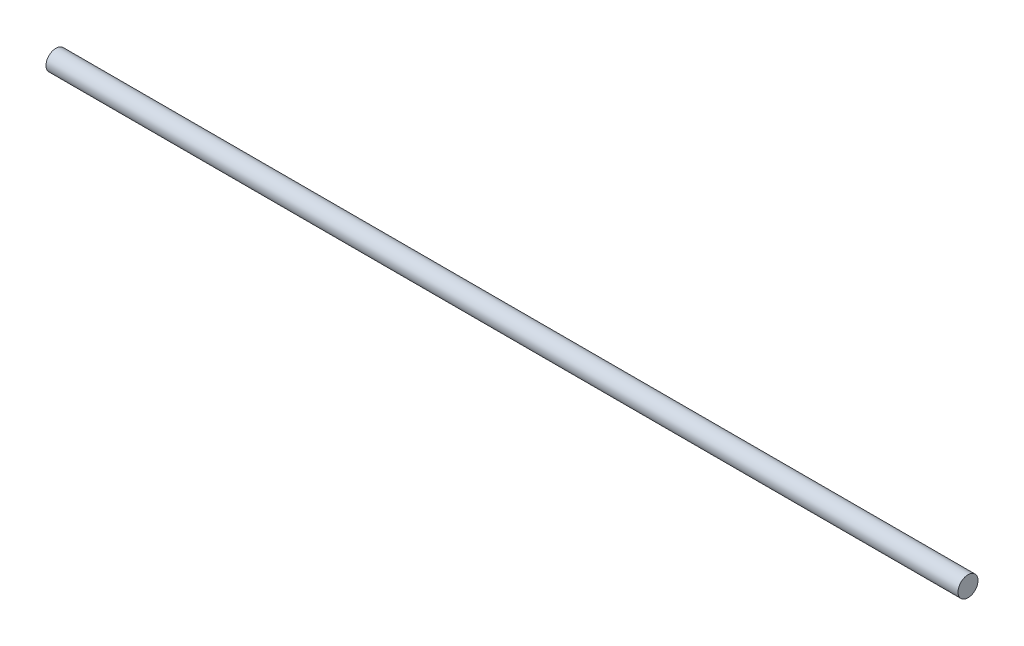
ISO-10303-21;
HEADER;
FILE_DESCRIPTION(('STEP AP214'),'2;1');
FILE_NAME('part.step','',(''),(''),'','','');
FILE_SCHEMA(('AUTOMOTIVE_DESIGN { 1 0 10303 214 1 1 1 1 }'));
ENDSEC;
DATA;
#1=APPLICATION_CONTEXT('core data for automotive mechanical design processes');
#2=APPLICATION_PROTOCOL_DEFINITION('international standard','automotive_design',2000,#1);
#3=PRODUCT_CONTEXT('',#1,'mechanical');
#4=PRODUCT('Part','Part','',(#3));
#5=PRODUCT_RELATED_PRODUCT_CATEGORY('part','',(#4));
#6=PRODUCT_DEFINITION_FORMATION('','',#4);
#7=PRODUCT_DEFINITION_CONTEXT('part definition',#1,'design');
#8=PRODUCT_DEFINITION('design','',#6,#7);
#9=PRODUCT_DEFINITION_SHAPE('','',#8);
#10=(LENGTH_UNIT() NAMED_UNIT(*) SI_UNIT(.MILLI.,.METRE.));
#11=(NAMED_UNIT(*) PLANE_ANGLE_UNIT() SI_UNIT($,.RADIAN.));
#12=(NAMED_UNIT(*) SI_UNIT($,.STERADIAN.) SOLID_ANGLE_UNIT());
#13=UNCERTAINTY_MEASURE_WITH_UNIT(LENGTH_MEASURE(1.E-05),#10,'distance_accuracy_value','');
#14=(GEOMETRIC_REPRESENTATION_CONTEXT(3) GLOBAL_UNCERTAINTY_ASSIGNED_CONTEXT((#13)) GLOBAL_UNIT_ASSIGNED_CONTEXT((#10,
#11,#12)) REPRESENTATION_CONTEXT('',''));
#15=CARTESIAN_POINT('',(0.,0.,0.));
#16=DIRECTION('',(0.,0.,1.));
#17=DIRECTION('',(1.,0.,0.));
#18=AXIS2_PLACEMENT_3D('',#15,#16,#17);
#19=CARTESIAN_POINT('',(228.,0.,0.));
#20=DIRECTION('',(-1.,0.,0.));
#21=DIRECTION('',(0.,0.,1.));
#22=AXIS2_PLACEMENT_3D('',#19,#20,#21);
#23=CYLINDRICAL_SURFACE('',#22,2.5);
#24=CARTESIAN_POINT('',(228.,0.,0.));
#25=DIRECTION('',(1.,0.,0.));
#26=DIRECTION('',(0.,0.,-1.));
#27=AXIS2_PLACEMENT_3D('',#24,#25,#26);
#28=CIRCLE('',#27,2.5);
#29=CARTESIAN_POINT('',(228.,0.,2.5));
#30=VERTEX_POINT('',#29);
#31=EDGE_CURVE('E10',#30,#30,#28,.T.);
#32=CARTESIAN_POINT('',(0.,0.,0.));
#33=DIRECTION('',(1.,0.,0.));
#34=DIRECTION('',(0.,0.,-1.));
#35=AXIS2_PLACEMENT_3D('',#32,#33,#34);
#36=CIRCLE('',#35,2.5);
#37=CARTESIAN_POINT('',(0.,0.,2.5));
#38=VERTEX_POINT('',#37);
#39=EDGE_CURVE('E40',#38,#38,#36,.T.);
#40=CARTESIAN_POINT('',(228.,0.,2.5));
#41=CARTESIAN_POINT('',(225.625,0.,2.5));
#42=CARTESIAN_POINT('',(223.25,0.,2.5));
#43=CARTESIAN_POINT('',(218.5,0.,2.5));
#44=CARTESIAN_POINT('',(216.125,0.,2.5));
#45=CARTESIAN_POINT('',(211.375,0.,2.5));
#46=CARTESIAN_POINT('',(209.,0.,2.5));
#47=CARTESIAN_POINT('',(204.25,0.,2.5));
#48=CARTESIAN_POINT('',(201.875,0.,2.5));
#49=CARTESIAN_POINT('',(197.125,0.,2.5));
#50=CARTESIAN_POINT('',(194.75,0.,2.5));
#51=CARTESIAN_POINT('',(190.,0.,2.5));
#52=CARTESIAN_POINT('',(187.625,0.,2.5));
#53=CARTESIAN_POINT('',(182.875,0.,2.5));
#54=CARTESIAN_POINT('',(180.5,0.,2.5));
#55=CARTESIAN_POINT('',(175.75,0.,2.5));
#56=CARTESIAN_POINT('',(173.375,0.,2.5));
#57=CARTESIAN_POINT('',(168.625,0.,2.5));
#58=CARTESIAN_POINT('',(166.25,0.,2.5));
#59=CARTESIAN_POINT('',(161.5,0.,2.5));
#60=CARTESIAN_POINT('',(159.125,0.,2.5));
#61=CARTESIAN_POINT('',(154.375,0.,2.5));
#62=CARTESIAN_POINT('',(152.,0.,2.5));
#63=CARTESIAN_POINT('',(147.25,0.,2.5));
#64=CARTESIAN_POINT('',(144.875,0.,2.5));
#65=CARTESIAN_POINT('',(140.125,0.,2.5));
#66=CARTESIAN_POINT('',(137.75,0.,2.5));
#67=CARTESIAN_POINT('',(133.,0.,2.5));
#68=CARTESIAN_POINT('',(130.625,0.,2.5));
#69=CARTESIAN_POINT('',(125.875,0.,2.5));
#70=CARTESIAN_POINT('',(123.5,0.,2.5));
#71=CARTESIAN_POINT('',(118.75,0.,2.5));
#72=CARTESIAN_POINT('',(116.375,0.,2.5));
#73=CARTESIAN_POINT('',(111.625,0.,2.5));
#74=CARTESIAN_POINT('',(109.25,0.,2.5));
#75=CARTESIAN_POINT('',(104.5,0.,2.5));
#76=CARTESIAN_POINT('',(102.125,0.,2.5));
#77=CARTESIAN_POINT('',(97.375,0.,2.5));
#78=CARTESIAN_POINT('',(95.,0.,2.5));
#79=CARTESIAN_POINT('',(90.25,0.,2.5));
#80=CARTESIAN_POINT('',(87.875,0.,2.5));
#81=CARTESIAN_POINT('',(83.125,0.,2.5));
#82=CARTESIAN_POINT('',(80.75,0.,2.5));
#83=CARTESIAN_POINT('',(76.,0.,2.5));
#84=CARTESIAN_POINT('',(73.625,0.,2.5));
#85=CARTESIAN_POINT('',(68.875,0.,2.5));
#86=CARTESIAN_POINT('',(66.5,0.,2.5));
#87=CARTESIAN_POINT('',(61.75,0.,2.5));
#88=CARTESIAN_POINT('',(59.375,0.,2.5));
#89=CARTESIAN_POINT('',(54.625,0.,2.5));
#90=CARTESIAN_POINT('',(52.25,0.,2.5));
#91=CARTESIAN_POINT('',(47.5,0.,2.5));
#92=CARTESIAN_POINT('',(45.125,0.,2.5));
#93=CARTESIAN_POINT('',(40.375,0.,2.5));
#94=CARTESIAN_POINT('',(38.,0.,2.5));
#95=CARTESIAN_POINT('',(33.25,0.,2.5));
#96=CARTESIAN_POINT('',(30.875,0.,2.5));
#97=CARTESIAN_POINT('',(26.125,0.,2.5));
#98=CARTESIAN_POINT('',(23.75,0.,2.5));
#99=CARTESIAN_POINT('',(19.,0.,2.5));
#100=CARTESIAN_POINT('',(16.625,0.,2.5));
#101=CARTESIAN_POINT('',(11.875,0.,2.5));
#102=CARTESIAN_POINT('',(9.5,0.,2.5));
#103=CARTESIAN_POINT('',(4.75,0.,2.5));
#104=CARTESIAN_POINT('',(2.375,0.,2.5));
#105=CARTESIAN_POINT('',(0.,0.,2.5));
#106=B_SPLINE_CURVE_WITH_KNOTS('',3,(#40,#41,#42,#43,#44,#45,#46,#47,#48,#49,#50,#51,#52,#53,
#54,#55,#56,#57,#58,#59,#60,#61,#62,#63,#64,#65,#66,#67,#68,#69,#70,#71,#72,#73,#74,#75,#76,#77,
#78,#79,#80,#81,#82,#83,#84,#85,#86,#87,#88,#89,#90,#91,#92,#93,#94,#95,#96,#97,#98,#99,#100,
#101,#102,#103,#104,#105),.UNSPECIFIED.,.F.,.F.,(4,2,2,2,2,2,2,2,2,2,2,2,2,2,2,2,2,2,2,2,2,2,2,
2,2,2,2,2,2,2,2,2,4),(0.,7.12499999999999,14.25,21.375,28.5,35.625,42.75,49.875,57.,64.125,
71.25,78.375,85.5,92.625,99.75,106.875,114.,121.125,128.25,135.375,142.5,149.625,156.75,163.875,
171.,178.125,185.25,192.375,199.5,206.625,213.75,220.875,228.),.UNSPECIFIED.);
#107=EDGE_CURVE('BSEAM37',#30,#38,#106,.T.);
#108=ORIENTED_EDGE('',*,*,#31,.F.);
#109=ORIENTED_EDGE('',*,*,#39,.T.);
#110=ORIENTED_EDGE('',*,*,#107,.T.);
#111=ORIENTED_EDGE('',*,*,#107,.F.);
#112=EDGE_LOOP('',(#108,#110,#109,#111));
#113=FACE_BOUND('',#112,.T.);
#114=ADVANCED_FACE('F37',(#113),#23,.T.);
#115=CARTESIAN_POINT('',(228.,0.,0.));
#116=DIRECTION('',(1.,0.,0.));
#117=DIRECTION('',(0.,0.,-1.));
#118=AXIS2_PLACEMENT_3D('',#115,#116,#117);
#119=PLANE('',#118);
#120=ORIENTED_EDGE('',*,*,#31,.T.);
#121=EDGE_LOOP('',(#120));
#122=FACE_BOUND('',#121,.T.);
#123=ADVANCED_FACE('F52',(#122),#119,.T.);
#124=CARTESIAN_POINT('',(0.,0.,0.));
#125=DIRECTION('',(1.,0.,0.));
#126=DIRECTION('',(0.,0.,-1.));
#127=AXIS2_PLACEMENT_3D('',#124,#125,#126);
#128=PLANE('',#127);
#129=ORIENTED_EDGE('',*,*,#39,.F.);
#130=EDGE_LOOP('',(#129));
#131=FACE_BOUND('',#130,.T.);
#132=ADVANCED_FACE('F50',(#131),#128,.F.);
#133=CLOSED_SHELL('',(#114,#123,#132));
#134=MANIFOLD_SOLID_BREP('B2',#133);
#135=ADVANCED_BREP_SHAPE_REPRESENTATION('',(#18,#134),#14);
#136=SHAPE_DEFINITION_REPRESENTATION(#9,#135);
ENDSEC;
END-ISO-10303-21;
